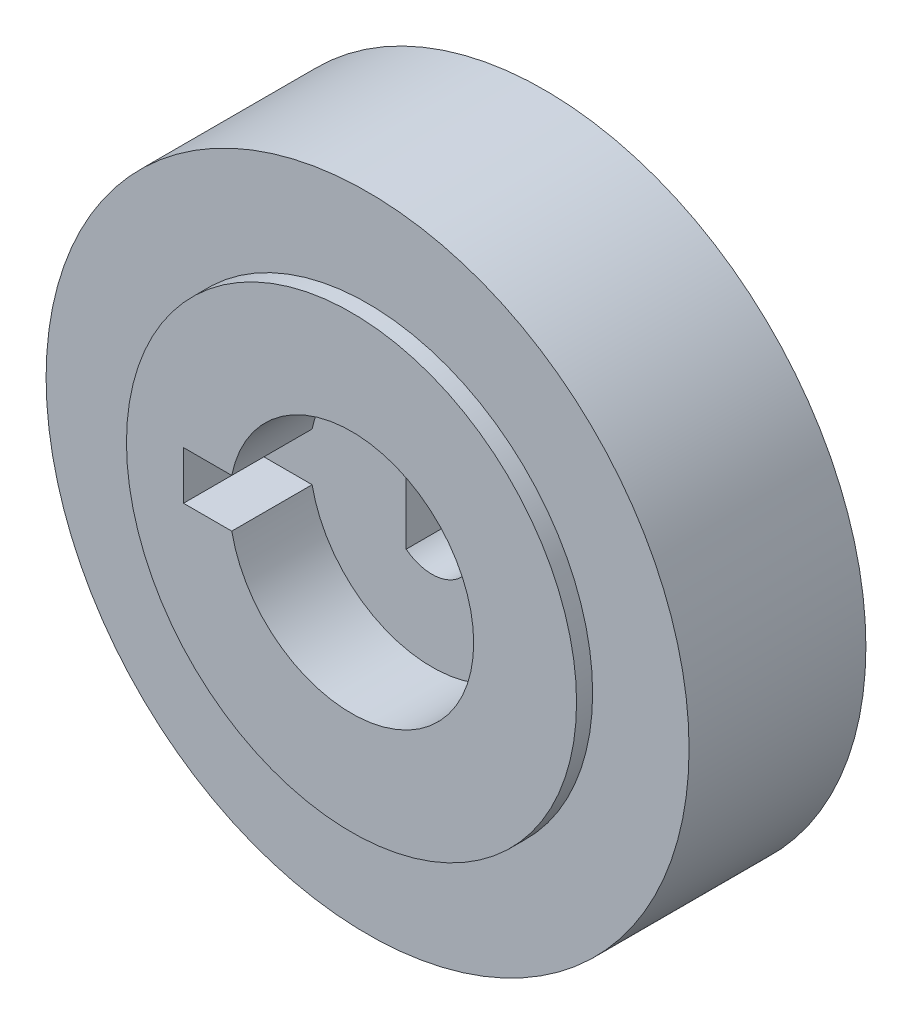
ISO-10303-21;
HEADER;
FILE_DESCRIPTION(('STEP AP214'),'2;1');
FILE_NAME('part.step','',(''),(''),'','','');
FILE_SCHEMA(('AUTOMOTIVE_DESIGN { 1 0 10303 214 1 1 1 1 }'));
ENDSEC;
DATA;
#1=APPLICATION_CONTEXT('core data for automotive mechanical design processes');
#2=APPLICATION_PROTOCOL_DEFINITION('international standard','automotive_design',2000,#1);
#3=PRODUCT_CONTEXT('',#1,'mechanical');
#4=PRODUCT('Part','Part','',(#3));
#5=PRODUCT_RELATED_PRODUCT_CATEGORY('part','',(#4));
#6=PRODUCT_DEFINITION_FORMATION('','',#4);
#7=PRODUCT_DEFINITION_CONTEXT('part definition',#1,'design');
#8=PRODUCT_DEFINITION('design','',#6,#7);
#9=PRODUCT_DEFINITION_SHAPE('','',#8);
#10=(LENGTH_UNIT() NAMED_UNIT(*) SI_UNIT(.MILLI.,.METRE.));
#11=(NAMED_UNIT(*) PLANE_ANGLE_UNIT() SI_UNIT($,.RADIAN.));
#12=(NAMED_UNIT(*) SI_UNIT($,.STERADIAN.) SOLID_ANGLE_UNIT());
#13=UNCERTAINTY_MEASURE_WITH_UNIT(LENGTH_MEASURE(1.E-05),#10,'distance_accuracy_value','');
#14=(GEOMETRIC_REPRESENTATION_CONTEXT(3) GLOBAL_UNCERTAINTY_ASSIGNED_CONTEXT((#13)) GLOBAL_UNIT_ASSIGNED_CONTEXT((#10,
#11,#12)) REPRESENTATION_CONTEXT('',''));
#15=CARTESIAN_POINT('',(0.,0.,0.));
#16=DIRECTION('',(0.,0.,1.));
#17=DIRECTION('',(1.,0.,0.));
#18=AXIS2_PLACEMENT_3D('',#15,#16,#17);
#19=CARTESIAN_POINT('',(0.,0.,12.));
#20=DIRECTION('',(0.,0.,-1.));
#21=DIRECTION('',(-1.,0.,0.));
#22=AXIS2_PLACEMENT_3D('',#19,#20,#21);
#23=CYLINDRICAL_SURFACE('',#22,2.6);
#24=DIRECTION('',(0.,0.,-1.));
#25=VECTOR('',#24,1.);
#26=CARTESIAN_POINT('',(-1.6,-2.04939015319192,12.));
#27=LINE('',#26,#25);
#28=CARTESIAN_POINT('',(-1.6,-2.04939015319192,7.));
#29=VERTEX_POINT('',#28);
#30=CARTESIAN_POINT('',(-1.6,-2.04939015319192,4.));
#31=VERTEX_POINT('',#30);
#32=EDGE_CURVE('E563',#29,#31,#27,.T.);
#33=ORIENTED_EDGE('',*,*,#32,.F.);
#34=CARTESIAN_POINT('',(0.,0.,7.));
#35=DIRECTION('',(0.,0.,1.));
#36=DIRECTION('',(1.,0.,0.));
#37=AXIS2_PLACEMENT_3D('',#34,#35,#36);
#38=CIRCLE('',#37,2.6);
#39=CARTESIAN_POINT('',(-1.6,2.04939015319192,7.));
#40=VERTEX_POINT('',#39);
#41=EDGE_CURVE('E440',#40,#29,#38,.F.);
#42=ORIENTED_EDGE('',*,*,#41,.F.);
#43=DIRECTION('',(0.,0.,-1.));
#44=VECTOR('',#43,1.);
#45=CARTESIAN_POINT('',(-1.6,2.04939015319192,12.));
#46=LINE('',#45,#44);
#47=CARTESIAN_POINT('',(-1.6,2.04939015319192,4.));
#48=VERTEX_POINT('',#47);
#49=EDGE_CURVE('E561',#40,#48,#46,.T.);
#50=ORIENTED_EDGE('',*,*,#49,.T.);
#51=CARTESIAN_POINT('',(0.,0.,4.));
#52=DIRECTION('',(0.,0.,1.));
#53=DIRECTION('',(1.,0.,0.));
#54=AXIS2_PLACEMENT_3D('',#51,#52,#53);
#55=CIRCLE('',#54,2.6);
#56=EDGE_CURVE('E568',#48,#31,#55,.F.);
#57=ORIENTED_EDGE('',*,*,#56,.T.);
#58=EDGE_LOOP('',(#33,#42,#50,#57));
#59=FACE_BOUND('',#58,.T.);
#60=ADVANCED_FACE('F95',(#59),#23,.F.);
#61=CARTESIAN_POINT('',(-1.6,0.,12.));
#62=DIRECTION('',(1.,0.,0.));
#63=DIRECTION('',(0.,0.,-1.));
#64=AXIS2_PLACEMENT_3D('',#61,#62,#63);
#65=PLANE('',#64);
#66=ORIENTED_EDGE('',*,*,#49,.F.);
#67=DIRECTION('',(0.,1.,0.));
#68=VECTOR('',#67,1.);
#69=CARTESIAN_POINT('',(-1.6,0.,7.));
#70=LINE('',#69,#68);
#71=EDGE_CURVE('E442',#29,#40,#70,.T.);
#72=ORIENTED_EDGE('',*,*,#71,.F.);
#73=ORIENTED_EDGE('',*,*,#32,.T.);
#74=DIRECTION('',(0.,1.,0.));
#75=VECTOR('',#74,1.);
#76=CARTESIAN_POINT('',(-1.6,0.,4.));
#77=LINE('',#76,#75);
#78=EDGE_CURVE('E565',#31,#48,#77,.T.);
#79=ORIENTED_EDGE('',*,*,#78,.T.);
#80=EDGE_LOOP('',(#66,#72,#73,#79));
#81=FACE_BOUND('',#80,.T.);
#82=ADVANCED_FACE('F328',(#81),#65,.T.);
#83=CARTESIAN_POINT('',(0.,0.,12.));
#84=DIRECTION('',(0.,0.,1.));
#85=DIRECTION('',(1.,0.,0.));
#86=AXIS2_PLACEMENT_3D('',#83,#84,#85);
#87=PLANE('',#86);
#88=CARTESIAN_POINT('',(0.,0.,12.));
#89=DIRECTION('',(0.,0.,1.));
#90=DIRECTION('',(1.,0.,0.));
#91=AXIS2_PLACEMENT_3D('',#88,#89,#90);
#92=CIRCLE('',#91,14.);
#93=CARTESIAN_POINT('',(14.,0.,12.));
#94=VERTEX_POINT('',#93);
#95=EDGE_CURVE('E558',#94,#94,#92,.T.);
#96=ORIENTED_EDGE('',*,*,#95,.T.);
#97=EDGE_LOOP('',(#96));
#98=FACE_BOUND('',#97,.T.);
#99=CARTESIAN_POINT('',(0.,0.,12.));
#100=DIRECTION('',(0.,0.,1.));
#101=DIRECTION('',(1.,0.,0.));
#102=AXIS2_PLACEMENT_3D('',#99,#100,#101);
#103=CIRCLE('',#102,7.6);
#104=CARTESIAN_POINT('',(-7.45050333870135,-1.5,12.));
#105=VERTEX_POINT('',#104);
#106=CARTESIAN_POINT('',(-7.45050333870135,1.5,12.));
#107=VERTEX_POINT('',#106);
#108=EDGE_CURVE('E459',#105,#107,#103,.T.);
#109=ORIENTED_EDGE('',*,*,#108,.F.);
#110=DIRECTION('',(-1.,0.,0.));
#111=VECTOR('',#110,1.);
#112=CARTESIAN_POINT('',(0.,-1.5,12.));
#113=LINE('',#112,#111);
#114=CARTESIAN_POINT('',(-10.4505033387014,-1.5,12.));
#115=VERTEX_POINT('',#114);
#116=EDGE_CURVE('E439',#105,#115,#113,.T.);
#117=ORIENTED_EDGE('',*,*,#116,.T.);
#118=DIRECTION('',(0.,1.,0.));
#119=VECTOR('',#118,1.);
#120=CARTESIAN_POINT('',(-10.4505033387014,0.,12.));
#121=LINE('',#120,#119);
#122=CARTESIAN_POINT('',(-10.4505033387014,1.5,12.));
#123=VERTEX_POINT('',#122);
#124=EDGE_CURVE('E443',#115,#123,#121,.T.);
#125=ORIENTED_EDGE('',*,*,#124,.T.);
#126=DIRECTION('',(-1.,0.,0.));
#127=VECTOR('',#126,1.);
#128=CARTESIAN_POINT('',(0.,1.5,12.));
#129=LINE('',#128,#127);
#130=EDGE_CURVE('E462',#107,#123,#129,.T.);
#131=ORIENTED_EDGE('',*,*,#130,.F.);
#132=EDGE_LOOP('',(#109,#117,#125,#131));
#133=FACE_BOUND('',#132,.T.);
#134=ADVANCED_FACE('F335',(#98,#133),#87,.T.);
#135=CARTESIAN_POINT('',(0.,0.,4.));
#136=DIRECTION('',(0.,0.,-1.));
#137=DIRECTION('',(-1.,0.,0.));
#138=AXIS2_PLACEMENT_3D('',#135,#136,#137);
#139=CYLINDRICAL_SURFACE('',#138,1.4);
#140=CARTESIAN_POINT('',(0.,0.,2.));
#141=DIRECTION('',(0.,0.,1.));
#142=DIRECTION('',(1.,0.,0.));
#143=AXIS2_PLACEMENT_3D('',#140,#141,#142);
#144=CIRCLE('',#143,1.4);
#145=CARTESIAN_POINT('',(1.4,0.,2.));
#146=VERTEX_POINT('',#145);
#147=EDGE_CURVE('E278',#146,#146,#144,.T.);
#148=ORIENTED_EDGE('',*,*,#147,.F.);
#149=EDGE_LOOP('',(#148));
#150=FACE_BOUND('',#149,.T.);
#151=CARTESIAN_POINT('',(0.,0.,4.));
#152=DIRECTION('',(0.,0.,1.));
#153=DIRECTION('',(1.,0.,0.));
#154=AXIS2_PLACEMENT_3D('',#151,#152,#153);
#155=CIRCLE('',#154,1.4);
#156=CARTESIAN_POINT('',(1.4,0.,4.));
#157=VERTEX_POINT('',#156);
#158=EDGE_CURVE('E571',#157,#157,#155,.T.);
#159=ORIENTED_EDGE('',*,*,#158,.T.);
#160=EDGE_LOOP('',(#159));
#161=FACE_BOUND('',#160,.T.);
#162=ADVANCED_FACE('F322',(#150,#161),#139,.F.);
#163=CARTESIAN_POINT('',(0.,0.,4.));
#164=DIRECTION('',(0.,0.,1.));
#165=DIRECTION('',(1.,0.,0.));
#166=AXIS2_PLACEMENT_3D('',#163,#164,#165);
#167=PLANE('',#166);
#168=ORIENTED_EDGE('',*,*,#56,.F.);
#169=ORIENTED_EDGE('',*,*,#78,.F.);
#170=EDGE_LOOP('',(#168,#169));
#171=FACE_BOUND('',#170,.T.);
#172=ORIENTED_EDGE('',*,*,#158,.F.);
#173=EDGE_LOOP('',(#172));
#174=FACE_BOUND('',#173,.T.);
#175=ADVANCED_FACE('F311',(#171,#174),#167,.T.);
#176=CARTESIAN_POINT('',(0.,0.,0.));
#177=DIRECTION('',(0.,0.,1.));
#178=DIRECTION('',(1.,0.,0.));
#179=AXIS2_PLACEMENT_3D('',#176,#177,#178);
#180=PLANE('',#179);
#181=DIRECTION('',(-0.866025403784429,-0.500000000000016,0.));
#182=VECTOR('',#181,1.);
#183=CARTESIAN_POINT('',(-0.375000000000013,0.649519052838322,0.));
#184=LINE('',#183,#182);
#185=CARTESIAN_POINT('',(-10.4287304944647,-5.15500495450106,0.));
#186=VERTEX_POINT('',#185);
#187=CARTESIAN_POINT('',(-10.7469875144544,-5.33875073066362,0.));
#188=VERTEX_POINT('',#187);
#189=EDGE_CURVE('E485',#186,#188,#184,.T.);
#190=ORIENTED_EDGE('',*,*,#189,.F.);
#191=CARTESIAN_POINT('',(0.,0.,0.));
#192=DIRECTION('',(0.,0.,1.));
#193=DIRECTION('',(1.,0.,0.));
#194=AXIS2_PLACEMENT_3D('',#191,#192,#193);
#195=CIRCLE('',#194,11.6332495807108);
#196=CARTESIAN_POINT('',(-9.67873049446467,-6.45404306017771,0.));
#197=VERTEX_POINT('',#196);
#198=EDGE_CURVE('E395',#186,#197,#195,.T.);
#199=ORIENTED_EDGE('',*,*,#198,.T.);
#200=DIRECTION('',(-0.866025403784429,-0.500000000000016,0.));
#201=VECTOR('',#200,1.);
#202=CARTESIAN_POINT('',(0.375000000000013,-0.649519052838324,0.));
#203=LINE('',#202,#201);
#204=CARTESIAN_POINT('',(-9.99698751445438,-6.63778883634026,0.));
#205=VERTEX_POINT('',#204);
#206=EDGE_CURVE('E506',#197,#205,#203,.T.);
#207=ORIENTED_EDGE('',*,*,#206,.T.);
#208=CARTESIAN_POINT('',(0.,0.,0.));
#209=DIRECTION('',(0.,0.,-1.));
#210=DIRECTION('',(-1.,0.,0.));
#211=AXIS2_PLACEMENT_3D('',#208,#209,#210);
#212=CIRCLE('',#211,12.);
#213=CARTESIAN_POINT('',(9.99698751445451,-6.63778883634007,0.));
#214=VERTEX_POINT('',#213);
#215=EDGE_CURVE('E510',#214,#205,#212,.T.);
#216=ORIENTED_EDGE('',*,*,#215,.F.);
#217=DIRECTION('',(0.866025403784432,-0.500000000000011,0.));
#218=VECTOR('',#217,1.);
#219=CARTESIAN_POINT('',(-0.374999999999925,-0.64951905283818,0.));
#220=LINE('',#219,#218);
#221=CARTESIAN_POINT('',(9.67873049446479,-6.45404306017751,0.));
#222=VERTEX_POINT('',#221);
#223=EDGE_CURVE('E514',#222,#214,#220,.T.);
#224=ORIENTED_EDGE('',*,*,#223,.F.);
#225=CARTESIAN_POINT('',(0.,0.,0.));
#226=DIRECTION('',(0.,0.,1.));
#227=DIRECTION('',(1.,0.,0.));
#228=AXIS2_PLACEMENT_3D('',#225,#226,#227);
#229=CIRCLE('',#228,11.6332495807108);
#230=CARTESIAN_POINT('',(10.4287304944648,-5.15500495450085,0.));
#231=VERTEX_POINT('',#230);
#232=EDGE_CURVE('E116',#222,#231,#229,.T.);
#233=ORIENTED_EDGE('',*,*,#232,.T.);
#234=DIRECTION('',(0.866025403784432,-0.500000000000012,0.));
#235=VECTOR('',#234,1.);
#236=CARTESIAN_POINT('',(0.375000000000093,0.64951905283847,0.));
#237=LINE('',#236,#235);
#238=CARTESIAN_POINT('',(10.7469875144545,-5.33875073066341,0.));
#239=VERTEX_POINT('',#238);
#240=EDGE_CURVE('E268',#231,#239,#237,.T.);
#241=ORIENTED_EDGE('',*,*,#240,.T.);
#242=CARTESIAN_POINT('',(0.,0.,0.));
#243=DIRECTION('',(0.,0.,-1.));
#244=DIRECTION('',(-1.,0.,0.));
#245=AXIS2_PLACEMENT_3D('',#242,#243,#244);
#246=CIRCLE('',#245,12.);
#247=CARTESIAN_POINT('',(0.75,11.9765395670035,0.));
#248=VERTEX_POINT('',#247);
#249=EDGE_CURVE('E537',#248,#239,#246,.T.);
#250=ORIENTED_EDGE('',*,*,#249,.F.);
#251=DIRECTION('',(0.,1.,0.));
#252=VECTOR('',#251,1.);
#253=CARTESIAN_POINT('',(0.75,0.,0.));
#254=LINE('',#253,#252);
#255=CARTESIAN_POINT('',(0.75,11.6090480146784,0.));
#256=VERTEX_POINT('',#255);
#257=EDGE_CURVE('E541',#256,#248,#254,.T.);
#258=ORIENTED_EDGE('',*,*,#257,.F.);
#259=CARTESIAN_POINT('',(0.,0.,0.));
#260=DIRECTION('',(0.,0.,1.));
#261=DIRECTION('',(1.,0.,0.));
#262=AXIS2_PLACEMENT_3D('',#259,#260,#261);
#263=CIRCLE('',#262,11.6332495807108);
#264=CARTESIAN_POINT('',(-0.75,11.6090480146784,0.));
#265=VERTEX_POINT('',#264);
#266=EDGE_CURVE('E574',#256,#265,#263,.T.);
#267=ORIENTED_EDGE('',*,*,#266,.T.);
#268=DIRECTION('',(0.,1.,0.));
#269=VECTOR('',#268,1.);
#270=CARTESIAN_POINT('',(-0.75,0.,0.));
#271=LINE('',#270,#269);
#272=CARTESIAN_POINT('',(-0.75,11.9765395670035,0.));
#273=VERTEX_POINT('',#272);
#274=EDGE_CURVE('E477',#265,#273,#271,.T.);
#275=ORIENTED_EDGE('',*,*,#274,.T.);
#276=CARTESIAN_POINT('',(0.,0.,0.));
#277=DIRECTION('',(0.,0.,-1.));
#278=DIRECTION('',(-1.,0.,0.));
#279=AXIS2_PLACEMENT_3D('',#276,#277,#278);
#280=CIRCLE('',#279,12.);
#281=EDGE_CURVE('E481',#188,#273,#280,.T.);
#282=ORIENTED_EDGE('',*,*,#281,.F.);
#283=EDGE_LOOP('',(#190,#199,#207,#216,#224,#233,#241,#250,#258,#267,#275,#282));
#284=FACE_BOUND('',#283,.T.);
#285=CARTESIAN_POINT('',(0.,0.,0.));
#286=DIRECTION('',(0.,0.,1.));
#287=DIRECTION('',(1.,0.,0.));
#288=AXIS2_PLACEMENT_3D('',#285,#286,#287);
#289=CIRCLE('',#288,20.);
#290=CARTESIAN_POINT('',(20.,0.,0.));
#291=VERTEX_POINT('',#290);
#292=EDGE_CURVE('E299',#291,#291,#289,.T.);
#293=ORIENTED_EDGE('',*,*,#292,.F.);
#294=EDGE_LOOP('',(#293));
#295=FACE_BOUND('',#294,.T.);
#296=ADVANCED_FACE('F308',(#284,#295),#180,.F.);
#297=CARTESIAN_POINT('',(0.,0.,12.));
#298=DIRECTION('',(0.,0.,-1.));
#299=DIRECTION('',(-1.,0.,0.));
#300=AXIS2_PLACEMENT_3D('',#297,#298,#299);
#301=CYLINDRICAL_SURFACE('',#300,14.);
#302=ORIENTED_EDGE('',*,*,#95,.F.);
#303=EDGE_LOOP('',(#302));
#304=FACE_BOUND('',#303,.T.);
#305=CARTESIAN_POINT('',(0.,0.,11.));
#306=DIRECTION('',(0.,0.,-1.));
#307=DIRECTION('',(-1.,0.,0.));
#308=AXIS2_PLACEMENT_3D('',#305,#306,#307);
#309=CIRCLE('',#308,14.);
#310=CARTESIAN_POINT('',(-14.,0.,11.));
#311=VERTEX_POINT('',#310);
#312=EDGE_CURVE('E290',#311,#311,#309,.T.);
#313=ORIENTED_EDGE('',*,*,#312,.F.);
#314=EDGE_LOOP('',(#313));
#315=FACE_BOUND('',#314,.T.);
#316=ADVANCED_FACE('F310',(#304,#315),#301,.T.);
#317=CARTESIAN_POINT('',(0.,0.,5.));
#318=DIRECTION('',(0.,0.,1.));
#319=DIRECTION('',(1.,0.,0.));
#320=AXIS2_PLACEMENT_3D('',#317,#318,#319);
#321=PLANE('',#320);
#322=DIRECTION('',(0.,1.,0.));
#323=VECTOR('',#322,1.);
#324=CARTESIAN_POINT('',(0.75,0.,5.));
#325=LINE('',#324,#323);
#326=CARTESIAN_POINT('',(0.75,4.53844687090198,5.));
#327=VERTEX_POINT('',#326);
#328=CARTESIAN_POINT('',(0.75,11.9765395670035,5.));
#329=VERTEX_POINT('',#328);
#330=EDGE_CURVE('E547',#327,#329,#325,.T.);
#331=ORIENTED_EDGE('',*,*,#330,.T.);
#332=CARTESIAN_POINT('',(0.,0.,5.));
#333=DIRECTION('',(0.,0.,1.));
#334=DIRECTION('',(1.,0.,0.));
#335=AXIS2_PLACEMENT_3D('',#332,#333,#334);
#336=CIRCLE('',#335,12.);
#337=CARTESIAN_POINT('',(10.7469875144545,-5.33875073066341,5.));
#338=VERTEX_POINT('',#337);
#339=EDGE_CURVE('E540',#329,#338,#336,.F.);
#340=ORIENTED_EDGE('',*,*,#339,.T.);
#341=DIRECTION('',(0.866025403784432,-0.500000000000012,0.));
#342=VECTOR('',#341,1.);
#343=CARTESIAN_POINT('',(0.375000000000093,0.64951905283847,5.));
#344=LINE('',#343,#342);
#345=CARTESIAN_POINT('',(4.30541028392715,-1.61970438261256,5.));
#346=VERTEX_POINT('',#345);
#347=EDGE_CURVE('E543',#346,#338,#344,.T.);
#348=ORIENTED_EDGE('',*,*,#347,.F.);
#349=CARTESIAN_POINT('',(0.,0.,5.));
#350=DIRECTION('',(0.,0.,1.));
#351=DIRECTION('',(1.,0.,0.));
#352=AXIS2_PLACEMENT_3D('',#349,#350,#351);
#353=CIRCLE('',#352,4.6);
#354=EDGE_CURVE('E534',#327,#346,#353,.F.);
#355=ORIENTED_EDGE('',*,*,#354,.F.);
#356=EDGE_LOOP('',(#331,#340,#348,#355));
#357=FACE_BOUND('',#356,.T.);
#358=ADVANCED_FACE('F318',(#357),#321,.F.);
#359=CARTESIAN_POINT('',(0.,0.,33.9596966156328));
#360=DIRECTION('',(0.,0.,-1.));
#361=DIRECTION('',(-1.,0.,0.));
#362=AXIS2_PLACEMENT_3D('',#359,#360,#361);
#363=CYLINDRICAL_SURFACE('',#362,12.);
#364=DIRECTION('',(0.,0.,-1.));
#365=VECTOR('',#364,1.);
#366=CARTESIAN_POINT('',(0.75,11.9765395670035,33.9596966156328));
#367=LINE('',#366,#365);
#368=EDGE_CURVE('E550',#329,#248,#367,.T.);
#369=ORIENTED_EDGE('',*,*,#368,.T.);
#370=ORIENTED_EDGE('',*,*,#249,.T.);
#371=DIRECTION('',(0.,0.,-1.));
#372=VECTOR('',#371,1.);
#373=CARTESIAN_POINT('',(10.7469875144545,-5.33875073066341,33.9596966156328));
#374=LINE('',#373,#372);
#375=EDGE_CURVE('E546',#338,#239,#374,.T.);
#376=ORIENTED_EDGE('',*,*,#375,.F.);
#377=ORIENTED_EDGE('',*,*,#339,.F.);
#378=EDGE_LOOP('',(#369,#370,#376,#377));
#379=FACE_BOUND('',#378,.T.);
#380=ADVANCED_FACE('F345',(#379),#363,.F.);
#381=CARTESIAN_POINT('',(0.375000000000093,0.64951905283847,33.9596966156328));
#382=DIRECTION('',(0.500000000000012,0.866025403784432,0.));
#383=DIRECTION('',(-0.866025403784432,0.500000000000012,0.));
#384=AXIS2_PLACEMENT_3D('',#381,#382,#383);
#385=PLANE('',#384);
#386=ORIENTED_EDGE('',*,*,#240,.F.);
#387=CARTESIAN_POINT('',(10.4287304944648,-5.15500495450085,0.));
#388=CARTESIAN_POINT('',(10.1312042262057,-4.9832280834305,-4.18353302775018E-05));
#389=CARTESIAN_POINT('',(9.83368081164115,-4.81145285994141,0.0146900329256624));
#390=CARTESIAN_POINT('',(9.24077476566226,-4.46913839469133,0.0733775169514432));
#391=CARTESIAN_POINT('',(8.94539233244648,-4.29859926736031,0.117335804253457));
#392=CARTESIAN_POINT('',(8.36589995423224,-3.96402918680497,0.232769633331213));
#393=CARTESIAN_POINT('',(8.08168869222404,-3.79993973817781,0.303569112871464));
#394=CARTESIAN_POINT('',(7.51938466553235,-3.47529335700094,0.472143949845235));
#395=CARTESIAN_POINT('',(7.24129042056458,-3.31473556980871,0.569912701563236));
#396=CARTESIAN_POINT('',(6.765729624024,-3.04017041590996,0.762271236609839));
#397=CARTESIAN_POINT('',(6.56641837481452,-2.92509801252634,0.85084312114458));
#398=CARTESIAN_POINT('',(6.17281342365751,-2.69785008802147,1.04177444744678));
#399=CARTESIAN_POINT('',(5.97851945865076,-2.5856744150229,1.14413316460604));
#400=CARTESIAN_POINT('',(5.59223707930897,-2.3626541793267,1.36415151266648));
#401=CARTESIAN_POINT('',(5.40035116164338,-2.25186879310877,1.48205093923393));
#402=CARTESIAN_POINT('',(5.02314416644525,-2.03408823289092,1.73117049838268));
#403=CARTESIAN_POINT('',(4.83782394212901,-1.92709355149565,1.86239235371987));
#404=CARTESIAN_POINT('',(4.65613594738597,-1.82219593882222,2.));
#405=B_SPLINE_CURVE_WITH_KNOTS('',3,(#387,#388,#389,#390,#391,#392,#393,#394,#395,#396,#397,
#398,#399,#400,#401,#402,#403,#404),.UNSPECIFIED.,.F.,.F.,(4,2,2,2,2,2,2,2,4),(0.,
1.03034431508331,2.06078282495963,3.06682736134476,4.07262570079603,4.81200093428171,
5.55133732284493,6.30382570151409,7.0564115105371),.UNSPECIFIED.);
#406=CARTESIAN_POINT('',(4.65613594738597,-1.82219593882222,2.));
#407=VERTEX_POINT('',#406);
#408=EDGE_CURVE('E261',#231,#407,#405,.T.);
#409=ORIENTED_EDGE('',*,*,#408,.T.);
#410=DIRECTION('',(0.866025403784432,-0.500000000000012,0.));
#411=VECTOR('',#410,1.);
#412=CARTESIAN_POINT('',(0.375000000000093,0.64951905283847,2.));
#413=LINE('',#412,#411);
#414=CARTESIAN_POINT('',(4.30541028392715,-1.61970438261256,2.));
#415=VERTEX_POINT('',#414);
#416=EDGE_CURVE('E265',#415,#407,#413,.T.);
#417=ORIENTED_EDGE('',*,*,#416,.F.);
#418=DIRECTION('',(0.,0.,-1.));
#419=VECTOR('',#418,1.);
#420=CARTESIAN_POINT('',(4.30541028392715,-1.61970438261256,33.9596966156328));
#421=LINE('',#420,#419);
#422=EDGE_CURVE('E536',#346,#415,#421,.T.);
#423=ORIENTED_EDGE('',*,*,#422,.F.);
#424=ORIENTED_EDGE('',*,*,#347,.T.);
#425=ORIENTED_EDGE('',*,*,#375,.T.);
#426=EDGE_LOOP('',(#386,#409,#417,#423,#424,#425));
#427=FACE_BOUND('',#426,.T.);
#428=ADVANCED_FACE('F263',(#427),#385,.T.);
#429=CARTESIAN_POINT('',(0.,0.,33.9596966156328));
#430=DIRECTION('',(0.,0.,-1.));
#431=DIRECTION('',(-1.,0.,0.));
#432=AXIS2_PLACEMENT_3D('',#429,#430,#431);
#433=CYLINDRICAL_SURFACE('',#432,4.6);
#434=CARTESIAN_POINT('',(0.,0.,2.));
#435=DIRECTION('',(0.,0.,1.));
#436=DIRECTION('',(1.,0.,0.));
#437=AXIS2_PLACEMENT_3D('',#434,#435,#436);
#438=CIRCLE('',#437,4.6);
#439=CARTESIAN_POINT('',(0.75,4.53844687090198,2.));
#440=VERTEX_POINT('',#439);
#441=EDGE_CURVE('E277',#440,#415,#438,.F.);
#442=ORIENTED_EDGE('',*,*,#441,.F.);
#443=DIRECTION('',(0.,0.,-1.));
#444=VECTOR('',#443,1.);
#445=CARTESIAN_POINT('',(0.75,4.53844687090198,33.9596966156328));
#446=LINE('',#445,#444);
#447=EDGE_CURVE('E429',#327,#440,#446,.T.);
#448=ORIENTED_EDGE('',*,*,#447,.F.);
#449=ORIENTED_EDGE('',*,*,#354,.T.);
#450=ORIENTED_EDGE('',*,*,#422,.T.);
#451=EDGE_LOOP('',(#442,#448,#449,#450));
#452=FACE_BOUND('',#451,.T.);
#453=ADVANCED_FACE('F353',(#452),#433,.T.);
#454=CARTESIAN_POINT('',(0.75,0.,33.9596966156328));
#455=DIRECTION('',(-1.,0.,0.));
#456=DIRECTION('',(0.,0.,1.));
#457=AXIS2_PLACEMENT_3D('',#454,#455,#456);
#458=PLANE('',#457);
#459=DIRECTION('',(0.,1.,0.));
#460=VECTOR('',#459,1.);
#461=CARTESIAN_POINT('',(0.75,0.,2.));
#462=LINE('',#461,#460);
#463=CARTESIAN_POINT('',(0.75,4.9434299833213,2.));
#464=VERTEX_POINT('',#463);
#465=EDGE_CURVE('E426',#440,#464,#462,.T.);
#466=ORIENTED_EDGE('',*,*,#465,.T.);
#467=CARTESIAN_POINT('',(0.75,4.9434299833213,2.));
#468=CARTESIAN_POINT('',(0.75,5.0893474821141,1.90430312472398));
#469=CARTESIAN_POINT('',(0.75,5.23726701669011,1.81169705960343));
#470=CARTESIAN_POINT('',(0.75,5.53690051696032,1.63283795454836));
#471=CARTESIAN_POINT('',(0.75,5.68861452876567,1.54658499186814));
#472=CARTESIAN_POINT('',(0.75,6.14913504735836,1.29761266497216));
#473=CARTESIAN_POINT('',(0.75,6.4633137120764,1.14468401311426));
#474=CARTESIAN_POINT('',(0.75,7.0958536228182,0.869710166692756));
#475=CARTESIAN_POINT('',(0.75,7.41393130203221,0.747009152436511));
#476=CARTESIAN_POINT('',(0.75,8.05921576711693,0.528796518198928));
#477=CARTESIAN_POINT('',(0.75,8.38641967939893,0.433276443510317));
#478=CARTESIAN_POINT('',(0.75,8.95127464357346,0.293933085677098));
#479=CARTESIAN_POINT('',(0.75,9.18723710837479,0.243156349625265));
#480=CARTESIAN_POINT('',(0.75,9.66177503960559,0.155811064934727));
#481=CARTESIAN_POINT('',(0.75,9.90035033047808,0.119241567654459));
#482=CARTESIAN_POINT('',(0.75,10.3834396548991,0.0599523100500162));
#483=CARTESIAN_POINT('',(0.75,10.6279846864505,0.0374852761956584));
#484=CARTESIAN_POINT('',(0.75,11.1180347856713,0.00750262551528834));
#485=CARTESIAN_POINT('',(0.75,11.3635400228252,-1.02202742368984E-05));
#486=CARTESIAN_POINT('',(0.75,11.6090480146784,0.));
#487=B_SPLINE_CURVE_WITH_KNOTS('',3,(#467,#468,#469,#470,#471,#472,#473,#474,#475,#476,#477,
#478,#479,#480,#481,#482,#483,#484,#485,#486),.UNSPECIFIED.,.F.,.F.,(4,2,2,2,2,2,2,2,2,4),(0.,
0.5234146608248,1.04683568536811,2.09370035793107,3.11531996853505,4.13662145326538,
4.860314567637,5.58395935147662,6.3202275772696,7.05663222212104),.UNSPECIFIED.);
#488=EDGE_CURVE('E109',#464,#256,#487,.T.);
#489=ORIENTED_EDGE('',*,*,#488,.T.);
#490=ORIENTED_EDGE('',*,*,#257,.T.);
#491=ORIENTED_EDGE('',*,*,#368,.F.);
#492=ORIENTED_EDGE('',*,*,#330,.F.);
#493=ORIENTED_EDGE('',*,*,#447,.T.);
#494=EDGE_LOOP('',(#466,#489,#490,#491,#492,#493));
#495=FACE_BOUND('',#494,.T.);
#496=ADVANCED_FACE('F411',(#495),#458,.F.);
#497=CARTESIAN_POINT('',(0.,0.,5.));
#498=DIRECTION('',(0.,0.,1.));
#499=DIRECTION('',(1.,0.,0.));
#500=AXIS2_PLACEMENT_3D('',#497,#498,#499);
#501=PLANE('',#500);
#502=DIRECTION('',(-0.866025403784429,-0.500000000000016,0.));
#503=VECTOR('',#502,1.);
#504=CARTESIAN_POINT('',(-0.375000000000013,0.649519052838322,5.));
#505=LINE('',#504,#503);
#506=CARTESIAN_POINT('',(-4.30541028392708,-1.61970438261274,5.));
#507=VERTEX_POINT('',#506);
#508=CARTESIAN_POINT('',(-10.7469875144544,-5.33875073066362,5.));
#509=VERTEX_POINT('',#508);
#510=EDGE_CURVE('E491',#507,#509,#505,.T.);
#511=ORIENTED_EDGE('',*,*,#510,.T.);
#512=CARTESIAN_POINT('',(0.,0.,5.));
#513=DIRECTION('',(0.,0.,1.));
#514=DIRECTION('',(1.,0.,0.));
#515=AXIS2_PLACEMENT_3D('',#512,#513,#514);
#516=CIRCLE('',#515,12.);
#517=CARTESIAN_POINT('',(-0.75,11.9765395670035,5.));
#518=VERTEX_POINT('',#517);
#519=EDGE_CURVE('E484',#509,#518,#516,.F.);
#520=ORIENTED_EDGE('',*,*,#519,.T.);
#521=DIRECTION('',(0.,1.,0.));
#522=VECTOR('',#521,1.);
#523=CARTESIAN_POINT('',(-0.75,0.,5.));
#524=LINE('',#523,#522);
#525=CARTESIAN_POINT('',(-0.75,4.53844687090198,5.));
#526=VERTEX_POINT('',#525);
#527=EDGE_CURVE('E487',#526,#518,#524,.T.);
#528=ORIENTED_EDGE('',*,*,#527,.F.);
#529=CARTESIAN_POINT('',(0.,0.,5.));
#530=DIRECTION('',(0.,0.,1.));
#531=DIRECTION('',(1.,0.,0.));
#532=AXIS2_PLACEMENT_3D('',#529,#530,#531);
#533=CIRCLE('',#532,4.6);
#534=EDGE_CURVE('E470',#507,#526,#533,.F.);
#535=ORIENTED_EDGE('',*,*,#534,.F.);
#536=EDGE_LOOP('',(#511,#520,#528,#535));
#537=FACE_BOUND('',#536,.T.);
#538=ADVANCED_FACE('F414',(#537),#501,.F.);
#539=CARTESIAN_POINT('',(0.,0.,33.9596966156328));
#540=DIRECTION('',(0.,0.,-1.));
#541=DIRECTION('',(-1.,0.,0.));
#542=AXIS2_PLACEMENT_3D('',#539,#540,#541);
#543=CYLINDRICAL_SURFACE('',#542,12.);
#544=DIRECTION('',(0.,0.,-1.));
#545=VECTOR('',#544,1.);
#546=CARTESIAN_POINT('',(-10.7469875144544,-5.33875073066362,33.9596966156328));
#547=LINE('',#546,#545);
#548=EDGE_CURVE('E494',#509,#188,#547,.T.);
#549=ORIENTED_EDGE('',*,*,#548,.T.);
#550=ORIENTED_EDGE('',*,*,#281,.T.);
#551=DIRECTION('',(0.,0.,-1.));
#552=VECTOR('',#551,1.);
#553=CARTESIAN_POINT('',(-0.75,11.9765395670035,33.9596966156328));
#554=LINE('',#553,#552);
#555=EDGE_CURVE('E490',#518,#273,#554,.T.);
#556=ORIENTED_EDGE('',*,*,#555,.F.);
#557=ORIENTED_EDGE('',*,*,#519,.F.);
#558=EDGE_LOOP('',(#549,#550,#556,#557));
#559=FACE_BOUND('',#558,.T.);
#560=ADVANCED_FACE('F420',(#559),#543,.F.);
#561=CARTESIAN_POINT('',(-0.75,0.,33.9596966156328));
#562=DIRECTION('',(-1.,0.,0.));
#563=DIRECTION('',(0.,0.,1.));
#564=AXIS2_PLACEMENT_3D('',#561,#562,#563);
#565=PLANE('',#564);
#566=ORIENTED_EDGE('',*,*,#274,.F.);
#567=CARTESIAN_POINT('',(-0.75,11.6090480146784,0.));
#568=CARTESIAN_POINT('',(-0.75,11.2654942725377,-4.18353302753854E-05));
#569=CARTESIAN_POINT('',(-0.75,10.9219438255595,0.0146900329256642));
#570=CARTESIAN_POINT('',(-0.75,10.2373148950594,0.0733775169514432));
#571=CARTESIAN_POINT('',(-0.75,9.89623664039735,0.117335804253456));
#572=CARTESIAN_POINT('',(-0.75,9.22709647928668,0.232769633331211));
#573=CARTESIAN_POINT('',(-0.75,8.89891758203237,0.303569112871464));
#574=CARTESIAN_POINT('',(-0.75,8.24962481967865,0.472143949845235));
#575=CARTESIAN_POINT('',(-0.75,7.92850924529419,0.569912701563235));
#576=CARTESIAN_POINT('',(-0.75,7.37937893749672,0.762271236609837));
#577=CARTESIAN_POINT('',(-0.75,7.14923413072948,0.850843121144579));
#578=CARTESIAN_POINT('',(-0.75,6.69473828171975,1.04177444744678));
#579=CARTESIAN_POINT('',(-0.75,6.47038693572262,1.14413316460604));
#580=CARTESIAN_POINT('',(-0.75,6.02434646433023,1.36415151266648));
#581=CARTESIAN_POINT('',(-0.75,5.80277569189437,1.48205093923393));
#582=CARTESIAN_POINT('',(-0.75,5.36721457145867,1.73117049838267));
#583=CARTESIAN_POINT('',(-0.75,5.15322520866814,1.86239235371987));
#584=CARTESIAN_POINT('',(-0.75,4.9434299833213,2.));
#585=B_SPLINE_CURVE_WITH_KNOTS('',3,(#567,#568,#569,#570,#571,#572,#573,#574,#575,#576,#577,
#578,#579,#580,#581,#582,#583,#584),.UNSPECIFIED.,.F.,.F.,(4,2,2,2,2,2,2,2,4),(0.,
1.0303443150833,2.06078282495963,3.06682736134476,4.07262570079602,4.8120009342817,
5.55133732284492,6.30382570151408,7.05641151053708),.UNSPECIFIED.);
#586=CARTESIAN_POINT('',(-0.75,4.9434299833213,2.));
#587=VERTEX_POINT('',#586);
#588=EDGE_CURVE('E13',#265,#587,#585,.T.);
#589=ORIENTED_EDGE('',*,*,#588,.T.);
#590=DIRECTION('',(0.,1.,0.));
#591=VECTOR('',#590,1.);
#592=CARTESIAN_POINT('',(-0.75,0.,2.));
#593=LINE('',#592,#591);
#594=CARTESIAN_POINT('',(-0.75,4.53844687090198,2.));
#595=VERTEX_POINT('',#594);
#596=EDGE_CURVE('E430',#595,#587,#593,.T.);
#597=ORIENTED_EDGE('',*,*,#596,.F.);
#598=DIRECTION('',(0.,0.,-1.));
#599=VECTOR('',#598,1.);
#600=CARTESIAN_POINT('',(-0.75,4.53844687090198,33.9596966156328));
#601=LINE('',#600,#599);
#602=EDGE_CURVE('E480',#526,#595,#601,.T.);
#603=ORIENTED_EDGE('',*,*,#602,.F.);
#604=ORIENTED_EDGE('',*,*,#527,.T.);
#605=ORIENTED_EDGE('',*,*,#555,.T.);
#606=EDGE_LOOP('',(#566,#589,#597,#603,#604,#605));
#607=FACE_BOUND('',#606,.T.);
#608=ADVANCED_FACE('F597',(#607),#565,.T.);
#609=CARTESIAN_POINT('',(0.,0.,33.9596966156328));
#610=DIRECTION('',(0.,0.,-1.));
#611=DIRECTION('',(-1.,0.,0.));
#612=AXIS2_PLACEMENT_3D('',#609,#610,#611);
#613=CYLINDRICAL_SURFACE('',#612,4.6);
#614=CARTESIAN_POINT('',(0.,0.,2.));
#615=DIRECTION('',(0.,0.,1.));
#616=DIRECTION('',(1.,0.,0.));
#617=AXIS2_PLACEMENT_3D('',#614,#615,#616);
#618=CIRCLE('',#617,4.6);
#619=CARTESIAN_POINT('',(-4.30541028392708,-1.61970438261274,2.));
#620=VERTEX_POINT('',#619);
#621=EDGE_CURVE('E433',#620,#595,#618,.F.);
#622=ORIENTED_EDGE('',*,*,#621,.F.);
#623=DIRECTION('',(0.,0.,-1.));
#624=VECTOR('',#623,1.);
#625=CARTESIAN_POINT('',(-4.30541028392708,-1.61970438261274,33.9596966156328));
#626=LINE('',#625,#624);
#627=EDGE_CURVE('E479',#507,#620,#626,.T.);
#628=ORIENTED_EDGE('',*,*,#627,.F.);
#629=ORIENTED_EDGE('',*,*,#534,.T.);
#630=ORIENTED_EDGE('',*,*,#602,.T.);
#631=EDGE_LOOP('',(#622,#628,#629,#630));
#632=FACE_BOUND('',#631,.T.);
#633=ADVANCED_FACE('F600',(#632),#613,.T.);
#634=CARTESIAN_POINT('',(-0.375000000000013,0.649519052838322,33.9596966156328));
#635=DIRECTION('',(0.500000000000016,-0.866025403784429,0.));
#636=DIRECTION('',(0.866025403784429,0.500000000000016,0.));
#637=AXIS2_PLACEMENT_3D('',#634,#635,#636);
#638=PLANE('',#637);
#639=DIRECTION('',(-0.866025403784429,-0.500000000000016,0.));
#640=VECTOR('',#639,1.);
#641=CARTESIAN_POINT('',(-0.375000000000013,0.649519052838322,2.));
#642=LINE('',#641,#640);
#643=CARTESIAN_POINT('',(-4.65613594738589,-1.82219593882241,2.));
#644=VERTEX_POINT('',#643);
#645=EDGE_CURVE('E588',#620,#644,#642,.T.);
#646=ORIENTED_EDGE('',*,*,#645,.T.);
#647=CARTESIAN_POINT('',(-4.65613594738589,-1.82219593882241,2.));
#648=CARTESIAN_POINT('',(-4.78250420819714,-1.89515468821881,1.90430312472398));
#649=CARTESIAN_POINT('',(-4.91060628285594,-1.96911445550682,1.81169705960343));
#650=CARTESIAN_POINT('',(-5.17009650591479,-2.11893120564193,1.63283795454836));
#651=CARTESIAN_POINT('',(-5.30148469424827,-2.19478821154461,1.54658499186813));
#652=CARTESIAN_POINT('',(-5.70030716231352,-2.42504847084096,1.29761266497216));
#653=CARTESIAN_POINT('',(-5.97239386728641,-2.58213780319998,1.14468401311425));
#654=CARTESIAN_POINT('',(-6.52018949889635,-2.89840775857089,0.869710166692754));
#655=CARTESIAN_POINT('',(-6.79565284947248,-3.05744659817791,0.747009152436508));
#656=CARTESIAN_POINT('',(-7.35448558890329,-3.38008883072028,0.528796518198925));
#657=CARTESIAN_POINT('',(-7.63785248915716,-3.54369078686128,0.433276443510314));
#658=CARTESIAN_POINT('',(-8.12703123758605,-3.82611826894856,0.293933085677096));
#659=CARTESIAN_POINT('',(-8.33138072644359,-3.94409950134923,0.243156349625265));
#660=CARTESIAN_POINT('',(-8.74234262994876,-4.18136846696463,0.155811064934727));
#661=CARTESIAN_POINT('',(-8.9489548925596,-4.30065611240088,0.119241567654458));
#662=CARTESIAN_POINT('',(-9.36732251980527,-4.5422007746114,0.0599523100500147));
#663=CARTESIAN_POINT('',(-9.57910472949807,-4.66447329038712,0.0374852761956574));
#664=CARTESIAN_POINT('',(-10.0035005645504,-4.90949833999754,0.00750262551528849));
#665=CARTESIAN_POINT('',(-10.2161143366877,-5.03225095857446,-1.02202742361421E-05));
#666=CARTESIAN_POINT('',(-10.4287304944647,-5.15500495450106,0.));
#667=B_SPLINE_CURVE_WITH_KNOTS('',3,(#647,#648,#649,#650,#651,#652,#653,#654,#655,#656,#657,
#658,#659,#660,#661,#662,#663,#664,#665,#666),.UNSPECIFIED.,.F.,.F.,(4,2,2,2,2,2,2,2,2,4),(0.,
0.523414660824801,1.04683568536811,2.09370035793107,3.11531996853505,4.13662145326538,
4.86031456763701,5.58395935147663,6.32022757726961,7.05663222212105),.UNSPECIFIED.);
#668=EDGE_CURVE('E380',#644,#186,#667,.T.);
#669=ORIENTED_EDGE('',*,*,#668,.T.);
#670=ORIENTED_EDGE('',*,*,#189,.T.);
#671=ORIENTED_EDGE('',*,*,#548,.F.);
#672=ORIENTED_EDGE('',*,*,#510,.F.);
#673=ORIENTED_EDGE('',*,*,#627,.T.);
#674=EDGE_LOOP('',(#646,#669,#670,#671,#672,#673));
#675=FACE_BOUND('',#674,.T.);
#676=ADVANCED_FACE('F409',(#675),#638,.F.);
#677=CARTESIAN_POINT('',(0.,0.,5.));
#678=DIRECTION('',(0.,0.,1.));
#679=DIRECTION('',(1.,0.,0.));
#680=AXIS2_PLACEMENT_3D('',#677,#678,#679);
#681=PLANE('',#680);
#682=DIRECTION('',(0.866025403784432,-0.500000000000011,0.));
#683=VECTOR('',#682,1.);
#684=CARTESIAN_POINT('',(-0.374999999999925,-0.64951905283818,5.));
#685=LINE('',#684,#683);
#686=CARTESIAN_POINT('',(3.55541028392718,-2.91874248828924,5.));
#687=VERTEX_POINT('',#686);
#688=CARTESIAN_POINT('',(9.9969875144545,-6.63778883634006,5.));
#689=VERTEX_POINT('',#688);
#690=EDGE_CURVE('E520',#687,#689,#685,.T.);
#691=ORIENTED_EDGE('',*,*,#690,.T.);
#692=CARTESIAN_POINT('',(0.,0.,5.));
#693=DIRECTION('',(0.,0.,1.));
#694=DIRECTION('',(1.,0.,0.));
#695=AXIS2_PLACEMENT_3D('',#692,#693,#694);
#696=CIRCLE('',#695,12.);
#697=CARTESIAN_POINT('',(-9.99698751445438,-6.63778883634026,5.));
#698=VERTEX_POINT('',#697);
#699=EDGE_CURVE('E513',#689,#698,#696,.F.);
#700=ORIENTED_EDGE('',*,*,#699,.T.);
#701=DIRECTION('',(-0.866025403784429,-0.500000000000016,0.));
#702=VECTOR('',#701,1.);
#703=CARTESIAN_POINT('',(0.375000000000013,-0.649519052838324,5.));
#704=LINE('',#703,#702);
#705=CARTESIAN_POINT('',(-3.55541028392706,-2.91874248828939,5.));
#706=VERTEX_POINT('',#705);
#707=EDGE_CURVE('E516',#706,#698,#704,.T.);
#708=ORIENTED_EDGE('',*,*,#707,.F.);
#709=CARTESIAN_POINT('',(0.,0.,5.));
#710=DIRECTION('',(0.,0.,1.));
#711=DIRECTION('',(1.,0.,0.));
#712=AXIS2_PLACEMENT_3D('',#709,#710,#711);
#713=CIRCLE('',#712,4.6);
#714=EDGE_CURVE('E505',#687,#706,#713,.F.);
#715=ORIENTED_EDGE('',*,*,#714,.F.);
#716=EDGE_LOOP('',(#691,#700,#708,#715));
#717=FACE_BOUND('',#716,.T.);
#718=ADVANCED_FACE('F406',(#717),#681,.F.);
#719=CARTESIAN_POINT('',(0.,0.,33.9596966156328));
#720=DIRECTION('',(0.,0.,-1.));
#721=DIRECTION('',(-1.,0.,0.));
#722=AXIS2_PLACEMENT_3D('',#719,#720,#721);
#723=CYLINDRICAL_SURFACE('',#722,12.);
#724=DIRECTION('',(0.,0.,-1.));
#725=VECTOR('',#724,1.);
#726=CARTESIAN_POINT('',(9.99698751445451,-6.63778883634007,33.9596966156328));
#727=LINE('',#726,#725);
#728=EDGE_CURVE('E523',#689,#214,#727,.T.);
#729=ORIENTED_EDGE('',*,*,#728,.T.);
#730=ORIENTED_EDGE('',*,*,#215,.T.);
#731=DIRECTION('',(0.,0.,-1.));
#732=VECTOR('',#731,1.);
#733=CARTESIAN_POINT('',(-9.99698751445438,-6.63778883634026,33.9596966156328));
#734=LINE('',#733,#732);
#735=EDGE_CURVE('E519',#698,#205,#734,.T.);
#736=ORIENTED_EDGE('',*,*,#735,.F.);
#737=ORIENTED_EDGE('',*,*,#699,.F.);
#738=EDGE_LOOP('',(#729,#730,#736,#737));
#739=FACE_BOUND('',#738,.T.);
#740=ADVANCED_FACE('F403',(#739),#723,.F.);
#741=CARTESIAN_POINT('',(0.375000000000013,-0.649519052838324,33.9596966156328));
#742=DIRECTION('',(0.500000000000016,-0.866025403784429,0.));
#743=DIRECTION('',(0.866025403784429,0.500000000000016,0.));
#744=AXIS2_PLACEMENT_3D('',#741,#742,#743);
#745=PLANE('',#744);
#746=ORIENTED_EDGE('',*,*,#206,.F.);
#747=CARTESIAN_POINT('',(-9.67873049446466,-6.4540430601777,0.));
#748=CARTESIAN_POINT('',(-9.38120422620562,-6.28226618910736,-4.18353302762433E-05));
#749=CARTESIAN_POINT('',(-9.08368081164103,-6.11049096561826,0.0146900329256637));
#750=CARTESIAN_POINT('',(-8.49077476566214,-5.76817650036818,0.0733775169514438));
#751=CARTESIAN_POINT('',(-8.19539233244637,-5.59763737303716,0.117335804253457));
#752=CARTESIAN_POINT('',(-7.61589995423212,-5.26306729248181,0.232769633331213));
#753=CARTESIAN_POINT('',(-7.33168869222393,-5.09897784385466,0.303569112871465));
#754=CARTESIAN_POINT('',(-6.76938466553224,-4.77433146267779,0.472143949845235));
#755=CARTESIAN_POINT('',(-6.49129042056447,-4.61377367548555,0.569912701563235));
#756=CARTESIAN_POINT('',(-6.01572962402389,-4.3392085215868,0.762271236609836));
#757=CARTESIAN_POINT('',(-5.81641837481441,-4.22413611820318,0.850843121144577));
#758=CARTESIAN_POINT('',(-5.42281342365741,-3.99688819369831,1.04177444744678));
#759=CARTESIAN_POINT('',(-5.22851945865066,-3.88471252069974,1.14413316460604));
#760=CARTESIAN_POINT('',(-4.84223707930887,-3.66169228500354,1.36415151266648));
#761=CARTESIAN_POINT('',(-4.65035116164328,-3.5509068987856,1.48205093923393));
#762=CARTESIAN_POINT('',(-4.27314416644515,-3.33312633856775,1.73117049838267));
#763=CARTESIAN_POINT('',(-4.08782394212891,-3.22613165717248,1.86239235371987));
#764=CARTESIAN_POINT('',(-3.90613594738587,-3.12123404449905,2.));
#765=B_SPLINE_CURVE_WITH_KNOTS('',3,(#747,#748,#749,#750,#751,#752,#753,#754,#755,#756,#757,
#758,#759,#760,#761,#762,#763,#764),.UNSPECIFIED.,.F.,.F.,(4,2,2,2,2,2,2,2,4),(0.,
1.0303443150833,2.06078282495963,3.06682736134475,4.07262570079602,4.8120009342817,
5.55133732284492,6.30382570151408,7.05641151053708),.UNSPECIFIED.);
#766=CARTESIAN_POINT('',(-3.90613594738587,-3.12123404449905,2.));
#767=VERTEX_POINT('',#766);
#768=EDGE_CURVE('E388',#197,#767,#765,.T.);
#769=ORIENTED_EDGE('',*,*,#768,.T.);
#770=DIRECTION('',(-0.866025403784429,-0.500000000000016,0.));
#771=VECTOR('',#770,1.);
#772=CARTESIAN_POINT('',(0.375000000000013,-0.649519052838324,2.));
#773=LINE('',#772,#771);
#774=CARTESIAN_POINT('',(-3.55541028392706,-2.91874248828939,2.));
#775=VERTEX_POINT('',#774);
#776=EDGE_CURVE('E285',#775,#767,#773,.T.);
#777=ORIENTED_EDGE('',*,*,#776,.F.);
#778=DIRECTION('',(0.,0.,-1.));
#779=VECTOR('',#778,1.);
#780=CARTESIAN_POINT('',(-3.55541028392706,-2.91874248828939,33.9596966156328));
#781=LINE('',#780,#779);
#782=EDGE_CURVE('E509',#706,#775,#781,.T.);
#783=ORIENTED_EDGE('',*,*,#782,.F.);
#784=ORIENTED_EDGE('',*,*,#707,.T.);
#785=ORIENTED_EDGE('',*,*,#735,.T.);
#786=EDGE_LOOP('',(#746,#769,#777,#783,#784,#785));
#787=FACE_BOUND('',#786,.T.);
#788=ADVANCED_FACE('F397',(#787),#745,.T.);
#789=CARTESIAN_POINT('',(0.,0.,33.9596966156328));
#790=DIRECTION('',(0.,0.,-1.));
#791=DIRECTION('',(-1.,0.,0.));
#792=AXIS2_PLACEMENT_3D('',#789,#790,#791);
#793=CYLINDRICAL_SURFACE('',#792,4.6);
#794=CARTESIAN_POINT('',(0.,0.,2.));
#795=DIRECTION('',(0.,0.,1.));
#796=DIRECTION('',(1.,0.,0.));
#797=AXIS2_PLACEMENT_3D('',#794,#795,#796);
#798=CIRCLE('',#797,4.6);
#799=CARTESIAN_POINT('',(3.55541028392718,-2.91874248828924,2.));
#800=VERTEX_POINT('',#799);
#801=EDGE_CURVE('E281',#800,#775,#798,.F.);
#802=ORIENTED_EDGE('',*,*,#801,.F.);
#803=DIRECTION('',(0.,0.,-1.));
#804=VECTOR('',#803,1.);
#805=CARTESIAN_POINT('',(3.55541028392718,-2.91874248828924,33.9596966156328));
#806=LINE('',#805,#804);
#807=EDGE_CURVE('E508',#687,#800,#806,.T.);
#808=ORIENTED_EDGE('',*,*,#807,.F.);
#809=ORIENTED_EDGE('',*,*,#714,.T.);
#810=ORIENTED_EDGE('',*,*,#782,.T.);
#811=EDGE_LOOP('',(#802,#808,#809,#810));
#812=FACE_BOUND('',#811,.T.);
#813=ADVANCED_FACE('F402',(#812),#793,.T.);
#814=CARTESIAN_POINT('',(-0.374999999999925,-0.64951905283818,33.9596966156328));
#815=DIRECTION('',(0.500000000000011,0.866025403784432,0.));
#816=DIRECTION('',(-0.866025403784432,0.500000000000011,0.));
#817=AXIS2_PLACEMENT_3D('',#814,#815,#816);
#818=PLANE('',#817);
#819=DIRECTION('',(0.866025403784432,-0.500000000000011,0.));
#820=VECTOR('',#819,1.);
#821=CARTESIAN_POINT('',(-0.374999999999925,-0.64951905283818,2.));
#822=LINE('',#821,#820);
#823=CARTESIAN_POINT('',(3.90613594738599,-3.1212340444989,2.));
#824=VERTEX_POINT('',#823);
#825=EDGE_CURVE('E573',#800,#824,#822,.T.);
#826=ORIENTED_EDGE('',*,*,#825,.T.);
#827=CARTESIAN_POINT('',(3.90613594738599,-3.1212340444989,2.));
#828=CARTESIAN_POINT('',(4.03250420819724,-3.1941927938953,1.90430312472398));
#829=CARTESIAN_POINT('',(4.16060628285603,-3.2681525611833,1.81169705960343));
#830=CARTESIAN_POINT('',(4.42009650591489,-3.41796931131841,1.63283795454836));
#831=CARTESIAN_POINT('',(4.55148469424836,-3.49382631722109,1.54658499186814));
#832=CARTESIAN_POINT('',(4.95030716231361,-3.72408657651743,1.29761266497217));
#833=CARTESIAN_POINT('',(5.2223938672865,-3.88117590887646,1.14468401311426));
#834=CARTESIAN_POINT('',(5.77018949889643,-4.19744586424736,0.869710166692762));
#835=CARTESIAN_POINT('',(6.04565284947256,-4.35648470385437,0.747009152436518));
#836=CARTESIAN_POINT('',(6.60448558890337,-4.67912693639673,0.528796518198936));
#837=CARTESIAN_POINT('',(6.88785248915724,-4.84272889253774,0.433276443510323));
#838=CARTESIAN_POINT('',(7.37703123758612,-5.12515637462501,0.293933085677103));
#839=CARTESIAN_POINT('',(7.58138072644367,-5.24313760702568,0.243156349625271));
#840=CARTESIAN_POINT('',(7.99234262994884,-5.48040657264108,0.15581106493473));
#841=CARTESIAN_POINT('',(8.19895489255969,-5.59969421807733,0.119241567654461));
#842=CARTESIAN_POINT('',(8.61732251980536,-5.84123888028785,0.0599523100500166));
#843=CARTESIAN_POINT('',(8.82910472949816,-5.96351139606357,0.0374852761956586));
#844=CARTESIAN_POINT('',(9.25350056455047,-6.20853644567398,0.00750262551528879));
#845=CARTESIAN_POINT('',(9.46611433668782,-6.3312890642509,-1.02202742361005E-05));
#846=CARTESIAN_POINT('',(9.67873049446479,-6.45404306017751,0.));
#847=B_SPLINE_CURVE_WITH_KNOTS('',3,(#827,#828,#829,#830,#831,#832,#833,#834,#835,#836,#837,
#838,#839,#840,#841,#842,#843,#844,#845,#846),.UNSPECIFIED.,.F.,.F.,(4,2,2,2,2,2,2,2,2,4),(0.,
0.523414660824795,1.0468356853681,2.09370035793105,3.11531996853502,4.13662145326534,
4.86031456763697,5.5839593514766,6.32022757726958,7.05663222212103),.UNSPECIFIED.);
#848=EDGE_CURVE('E124',#824,#222,#847,.T.);
#849=ORIENTED_EDGE('',*,*,#848,.T.);
#850=ORIENTED_EDGE('',*,*,#223,.T.);
#851=ORIENTED_EDGE('',*,*,#728,.F.);
#852=ORIENTED_EDGE('',*,*,#690,.F.);
#853=ORIENTED_EDGE('',*,*,#807,.T.);
#854=EDGE_LOOP('',(#826,#849,#850,#851,#852,#853));
#855=FACE_BOUND('',#854,.T.);
#856=ADVANCED_FACE('F637',(#855),#818,.F.);
#857=CARTESIAN_POINT('',(0.,-1.5,7.));
#858=DIRECTION('',(0.,1.,0.));
#859=DIRECTION('',(0.,0.,1.));
#860=AXIS2_PLACEMENT_3D('',#857,#858,#859);
#861=PLANE('',#860);
#862=ORIENTED_EDGE('',*,*,#116,.F.);
#863=DIRECTION('',(0.,0.,1.));
#864=VECTOR('',#863,1.);
#865=CARTESIAN_POINT('',(-7.45050333870135,-1.5,7.));
#866=LINE('',#865,#864);
#867=CARTESIAN_POINT('',(-7.45050333870135,-1.5,7.));
#868=VERTEX_POINT('',#867);
#869=EDGE_CURVE('E456',#868,#105,#866,.T.);
#870=ORIENTED_EDGE('',*,*,#869,.F.);
#871=DIRECTION('',(-1.,0.,0.));
#872=VECTOR('',#871,1.);
#873=CARTESIAN_POINT('',(0.,-1.5,7.));
#874=LINE('',#873,#872);
#875=CARTESIAN_POINT('',(-10.4505033387014,-1.5,7.));
#876=VERTEX_POINT('',#875);
#877=EDGE_CURVE('E445',#868,#876,#874,.T.);
#878=ORIENTED_EDGE('',*,*,#877,.T.);
#879=DIRECTION('',(0.,0.,1.));
#880=VECTOR('',#879,1.);
#881=CARTESIAN_POINT('',(-10.4505033387014,-1.5,7.));
#882=LINE('',#881,#880);
#883=EDGE_CURVE('E467',#876,#115,#882,.T.);
#884=ORIENTED_EDGE('',*,*,#883,.T.);
#885=EDGE_LOOP('',(#862,#870,#878,#884));
#886=FACE_BOUND('',#885,.T.);
#887=ADVANCED_FACE('F628',(#886),#861,.T.);
#888=CARTESIAN_POINT('',(-10.4505033387014,0.,7.));
#889=DIRECTION('',(1.,0.,0.));
#890=DIRECTION('',(0.,0.,-1.));
#891=AXIS2_PLACEMENT_3D('',#888,#889,#890);
#892=PLANE('',#891);
#893=ORIENTED_EDGE('',*,*,#124,.F.);
#894=ORIENTED_EDGE('',*,*,#883,.F.);
#895=DIRECTION('',(0.,1.,0.));
#896=VECTOR('',#895,1.);
#897=CARTESIAN_POINT('',(-10.4505033387014,0.,7.));
#898=LINE('',#897,#896);
#899=CARTESIAN_POINT('',(-10.4505033387014,1.5,7.));
#900=VERTEX_POINT('',#899);
#901=EDGE_CURVE('E454',#876,#900,#898,.T.);
#902=ORIENTED_EDGE('',*,*,#901,.T.);
#903=DIRECTION('',(0.,0.,1.));
#904=VECTOR('',#903,1.);
#905=CARTESIAN_POINT('',(-10.4505033387014,1.5,7.));
#906=LINE('',#905,#904);
#907=EDGE_CURVE('E471',#900,#123,#906,.T.);
#908=ORIENTED_EDGE('',*,*,#907,.T.);
#909=EDGE_LOOP('',(#893,#894,#902,#908));
#910=FACE_BOUND('',#909,.T.);
#911=ADVANCED_FACE('F624',(#910),#892,.T.);
#912=CARTESIAN_POINT('',(0.,1.5,7.));
#913=DIRECTION('',(0.,1.,0.));
#914=DIRECTION('',(0.,0.,1.));
#915=AXIS2_PLACEMENT_3D('',#912,#913,#914);
#916=PLANE('',#915);
#917=ORIENTED_EDGE('',*,*,#130,.T.);
#918=ORIENTED_EDGE('',*,*,#907,.F.);
#919=DIRECTION('',(-1.,0.,0.));
#920=VECTOR('',#919,1.);
#921=CARTESIAN_POINT('',(0.,1.5,7.));
#922=LINE('',#921,#920);
#923=CARTESIAN_POINT('',(-7.45050333870135,1.5,7.));
#924=VERTEX_POINT('',#923);
#925=EDGE_CURVE('E451',#924,#900,#922,.T.);
#926=ORIENTED_EDGE('',*,*,#925,.F.);
#927=DIRECTION('',(0.,0.,1.));
#928=VECTOR('',#927,1.);
#929=CARTESIAN_POINT('',(-7.45050333870135,1.5,7.));
#930=LINE('',#929,#928);
#931=EDGE_CURVE('E473',#924,#107,#930,.T.);
#932=ORIENTED_EDGE('',*,*,#931,.T.);
#933=EDGE_LOOP('',(#917,#918,#926,#932));
#934=FACE_BOUND('',#933,.T.);
#935=ADVANCED_FACE('F627',(#934),#916,.F.);
#936=CARTESIAN_POINT('',(0.,0.,7.));
#937=DIRECTION('',(0.,0.,1.));
#938=DIRECTION('',(1.,0.,0.));
#939=AXIS2_PLACEMENT_3D('',#936,#937,#938);
#940=CYLINDRICAL_SURFACE('',#939,7.6);
#941=ORIENTED_EDGE('',*,*,#108,.T.);
#942=ORIENTED_EDGE('',*,*,#931,.F.);
#943=CARTESIAN_POINT('',(0.,0.,7.));
#944=DIRECTION('',(0.,0.,1.));
#945=DIRECTION('',(1.,0.,0.));
#946=AXIS2_PLACEMENT_3D('',#943,#944,#945);
#947=CIRCLE('',#946,7.6);
#948=EDGE_CURVE('E448',#868,#924,#947,.T.);
#949=ORIENTED_EDGE('',*,*,#948,.F.);
#950=ORIENTED_EDGE('',*,*,#869,.T.);
#951=EDGE_LOOP('',(#941,#942,#949,#950));
#952=FACE_BOUND('',#951,.T.);
#953=ADVANCED_FACE('F622',(#952),#940,.F.);
#954=CARTESIAN_POINT('',(0.,0.,7.));
#955=DIRECTION('',(0.,0.,1.));
#956=DIRECTION('',(1.,0.,0.));
#957=AXIS2_PLACEMENT_3D('',#954,#955,#956);
#958=PLANE('',#957);
#959=ORIENTED_EDGE('',*,*,#41,.T.);
#960=ORIENTED_EDGE('',*,*,#71,.T.);
#961=EDGE_LOOP('',(#959,#960));
#962=FACE_BOUND('',#961,.T.);
#963=ORIENTED_EDGE('',*,*,#877,.F.);
#964=ORIENTED_EDGE('',*,*,#948,.T.);
#965=ORIENTED_EDGE('',*,*,#925,.T.);
#966=ORIENTED_EDGE('',*,*,#901,.F.);
#967=EDGE_LOOP('',(#963,#964,#965,#966));
#968=FACE_BOUND('',#967,.T.);
#969=ADVANCED_FACE('F618',(#962,#968),#958,.T.);
#970=CARTESIAN_POINT('',(0.,0.,2.));
#971=DIRECTION('',(0.,0.,1.));
#972=DIRECTION('',(1.,0.,0.));
#973=AXIS2_PLACEMENT_3D('',#970,#971,#972);
#974=PLANE('',#973);
#975=ORIENTED_EDGE('',*,*,#147,.T.);
#976=EDGE_LOOP('',(#975));
#977=FACE_BOUND('',#976,.T.);
#978=ORIENTED_EDGE('',*,*,#416,.T.);
#979=CARTESIAN_POINT('',(0.,0.,2.));
#980=DIRECTION('',(0.,0.,1.));
#981=DIRECTION('',(1.,0.,0.));
#982=AXIS2_PLACEMENT_3D('',#979,#980,#981);
#983=CIRCLE('',#982,5.);
#984=EDGE_CURVE('E275',#407,#824,#983,.F.);
#985=ORIENTED_EDGE('',*,*,#984,.T.);
#986=ORIENTED_EDGE('',*,*,#825,.F.);
#987=ORIENTED_EDGE('',*,*,#801,.T.);
#988=ORIENTED_EDGE('',*,*,#776,.T.);
#989=EDGE_CURVE('E282',#767,#644,#983,.F.);
#990=ORIENTED_EDGE('',*,*,#989,.T.);
#991=ORIENTED_EDGE('',*,*,#645,.F.);
#992=ORIENTED_EDGE('',*,*,#621,.T.);
#993=ORIENTED_EDGE('',*,*,#596,.T.);
#994=EDGE_CURVE('E284',#587,#464,#983,.F.);
#995=ORIENTED_EDGE('',*,*,#994,.T.);
#996=ORIENTED_EDGE('',*,*,#465,.F.);
#997=ORIENTED_EDGE('',*,*,#441,.T.);
#998=EDGE_LOOP('',(#978,#985,#986,#987,#988,#990,#991,#992,#993,#995,#996,#997));
#999=FACE_BOUND('',#998,.T.);
#1000=ADVANCED_FACE('F274',(#977,#999),#974,.F.);
#1001=CARTESIAN_POINT('',(0.,0.,12.));
#1002=DIRECTION('',(0.,0.,1.));
#1003=DIRECTION('',(1.,0.,0.));
#1004=AXIS2_PLACEMENT_3D('',#1001,#1002,#1003);
#1005=DEGENERATE_TOROIDAL_SURFACE('',#1004,11.6332495807108,12.,.T.);
#1006=ORIENTED_EDGE('',*,*,#768,.F.);
#1007=ORIENTED_EDGE('',*,*,#198,.F.);
#1008=ORIENTED_EDGE('',*,*,#668,.F.);
#1009=ORIENTED_EDGE('',*,*,#989,.F.);
#1010=EDGE_LOOP('',(#1006,#1007,#1008,#1009));
#1011=FACE_BOUND('',#1010,.T.);
#1012=ADVANCED_FACE('F373',(#1011),#1005,.T.);
#1013=CARTESIAN_POINT('',(0.,0.,12.));
#1014=DIRECTION('',(0.,0.,1.));
#1015=DIRECTION('',(1.,0.,0.));
#1016=AXIS2_PLACEMENT_3D('',#1013,#1014,#1015);
#1017=DEGENERATE_TOROIDAL_SURFACE('',#1016,11.6332495807108,12.,.T.);
#1018=ORIENTED_EDGE('',*,*,#408,.F.);
#1019=ORIENTED_EDGE('',*,*,#232,.F.);
#1020=ORIENTED_EDGE('',*,*,#848,.F.);
#1021=ORIENTED_EDGE('',*,*,#984,.F.);
#1022=EDGE_LOOP('',(#1018,#1019,#1020,#1021));
#1023=FACE_BOUND('',#1022,.T.);
#1024=ADVANCED_FACE('F280',(#1023),#1017,.T.);
#1025=CARTESIAN_POINT('',(0.,0.,12.));
#1026=DIRECTION('',(0.,0.,1.));
#1027=DIRECTION('',(1.,0.,0.));
#1028=AXIS2_PLACEMENT_3D('',#1025,#1026,#1027);
#1029=DEGENERATE_TOROIDAL_SURFACE('',#1028,11.6332495807108,12.,.T.);
#1030=ORIENTED_EDGE('',*,*,#588,.F.);
#1031=ORIENTED_EDGE('',*,*,#266,.F.);
#1032=ORIENTED_EDGE('',*,*,#488,.F.);
#1033=ORIENTED_EDGE('',*,*,#994,.F.);
#1034=EDGE_LOOP('',(#1030,#1031,#1032,#1033));
#1035=FACE_BOUND('',#1034,.T.);
#1036=ADVANCED_FACE('F97',(#1035),#1029,.T.);
#1037=CARTESIAN_POINT('',(0.,0.,11.));
#1038=DIRECTION('',(0.,0.,-1.));
#1039=DIRECTION('',(-1.,0.,0.));
#1040=AXIS2_PLACEMENT_3D('',#1037,#1038,#1039);
#1041=PLANE('',#1040);
#1042=ORIENTED_EDGE('',*,*,#312,.T.);
#1043=EDGE_LOOP('',(#1042));
#1044=FACE_BOUND('',#1043,.T.);
#1045=CARTESIAN_POINT('',(0.,0.,11.));
#1046=DIRECTION('',(0.,0.,-1.));
#1047=DIRECTION('',(-1.,0.,0.));
#1048=AXIS2_PLACEMENT_3D('',#1045,#1046,#1047);
#1049=CIRCLE('',#1048,20.);
#1050=CARTESIAN_POINT('',(-20.,0.,11.));
#1051=VERTEX_POINT('',#1050);
#1052=EDGE_CURVE('E295',#1051,#1051,#1049,.T.);
#1053=ORIENTED_EDGE('',*,*,#1052,.F.);
#1054=EDGE_LOOP('',(#1053));
#1055=FACE_BOUND('',#1054,.T.);
#1056=ADVANCED_FACE('F606',(#1044,#1055),#1041,.F.);
#1057=CARTESIAN_POINT('',(0.,0.,-56.5685424949238));
#1058=DIRECTION('',(0.,0.,1.));
#1059=DIRECTION('',(1.,0.,0.));
#1060=AXIS2_PLACEMENT_3D('',#1057,#1058,#1059);
#1061=CYLINDRICAL_SURFACE('',#1060,20.);
#1062=ORIENTED_EDGE('',*,*,#292,.T.);
#1063=EDGE_LOOP('',(#1062));
#1064=FACE_BOUND('',#1063,.T.);
#1065=ORIENTED_EDGE('',*,*,#1052,.T.);
#1066=EDGE_LOOP('',(#1065));
#1067=FACE_BOUND('',#1066,.T.);
#1068=ADVANCED_FACE('F305',(#1064,#1067),#1061,.T.);
#1069=CLOSED_SHELL('',(#60,#82,#134,#162,#175,#296,#316,#358,#380,#428,#453,#496,#538,#560,#608,
#633,#676,#718,#740,#788,#813,#856,#887,#911,#935,#953,#969,#1000,#1012,#1024,#1036,#1056,#1068));
#1070=MANIFOLD_SOLID_BREP('B2',#1069);
#1071=ADVANCED_BREP_SHAPE_REPRESENTATION('',(#18,#1070),#14);
#1072=SHAPE_DEFINITION_REPRESENTATION(#9,#1071);
ENDSEC;
END-ISO-10303-21;
